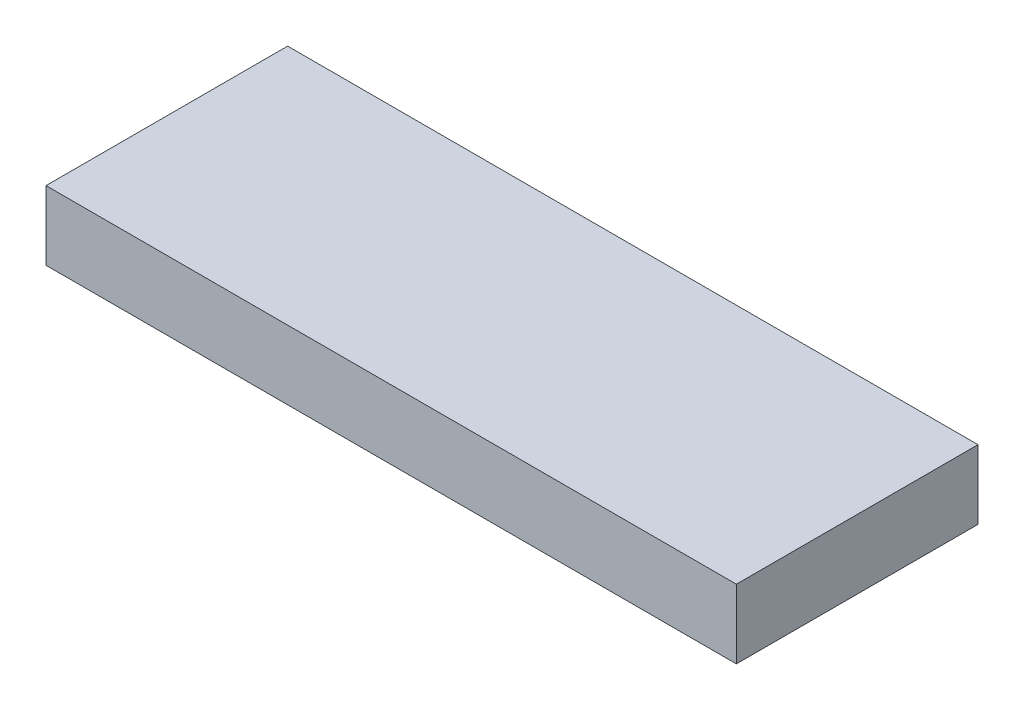
ISO-10303-21;
HEADER;
FILE_DESCRIPTION(('STEP AP214'),'2;1');
FILE_NAME('part.step','',(''),(''),'','','');
FILE_SCHEMA(('AUTOMOTIVE_DESIGN { 1 0 10303 214 1 1 1 1 }'));
ENDSEC;
DATA;
#1=APPLICATION_CONTEXT('core data for automotive mechanical design processes');
#2=APPLICATION_PROTOCOL_DEFINITION('international standard','automotive_design',2000,#1);
#3=PRODUCT_CONTEXT('',#1,'mechanical');
#4=PRODUCT('Part','Part','',(#3));
#5=PRODUCT_RELATED_PRODUCT_CATEGORY('part','',(#4));
#6=PRODUCT_DEFINITION_FORMATION('','',#4);
#7=PRODUCT_DEFINITION_CONTEXT('part definition',#1,'design');
#8=PRODUCT_DEFINITION('design','',#6,#7);
#9=PRODUCT_DEFINITION_SHAPE('','',#8);
#10=(LENGTH_UNIT() NAMED_UNIT(*) SI_UNIT(.MILLI.,.METRE.));
#11=(NAMED_UNIT(*) PLANE_ANGLE_UNIT() SI_UNIT($,.RADIAN.));
#12=(NAMED_UNIT(*) SI_UNIT($,.STERADIAN.) SOLID_ANGLE_UNIT());
#13=UNCERTAINTY_MEASURE_WITH_UNIT(LENGTH_MEASURE(1.E-05),#10,'distance_accuracy_value','');
#14=(GEOMETRIC_REPRESENTATION_CONTEXT(3) GLOBAL_UNCERTAINTY_ASSIGNED_CONTEXT((#13)) GLOBAL_UNIT_ASSIGNED_CONTEXT((#10,
#11,#12)) REPRESENTATION_CONTEXT('',''));
#15=CARTESIAN_POINT('',(0.,0.,0.));
#16=DIRECTION('',(0.,0.,1.));
#17=DIRECTION('',(1.,0.,0.));
#18=AXIS2_PLACEMENT_3D('',#15,#16,#17);
#19=CARTESIAN_POINT('',(500.,100.,175.));
#20=DIRECTION('',(-1.,0.,0.));
#21=DIRECTION('',(0.,0.,1.));
#22=AXIS2_PLACEMENT_3D('',#19,#20,#21);
#23=PLANE('',#22);
#24=DIRECTION('',(0.,0.,-1.));
#25=VECTOR('',#24,1.);
#26=CARTESIAN_POINT('',(500.,0.,175.));
#27=LINE('',#26,#25);
#28=CARTESIAN_POINT('',(500.,0.,175.));
#29=VERTEX_POINT('',#28);
#30=CARTESIAN_POINT('',(500.,0.,-175.));
#31=VERTEX_POINT('',#30);
#32=EDGE_CURVE('E107',#29,#31,#27,.T.);
#33=ORIENTED_EDGE('',*,*,#32,.T.);
#34=DIRECTION('',(0.,-1.,0.));
#35=VECTOR('',#34,1.);
#36=CARTESIAN_POINT('',(500.,100.,-175.));
#37=LINE('',#36,#35);
#38=CARTESIAN_POINT('',(500.,100.,-175.));
#39=VERTEX_POINT('',#38);
#40=EDGE_CURVE('E11',#39,#31,#37,.T.);
#41=ORIENTED_EDGE('',*,*,#40,.F.);
#42=DIRECTION('',(0.,0.,-1.));
#43=VECTOR('',#42,1.);
#44=CARTESIAN_POINT('',(500.,100.,175.));
#45=LINE('',#44,#43);
#46=CARTESIAN_POINT('',(500.,100.,175.));
#47=VERTEX_POINT('',#46);
#48=EDGE_CURVE('E96',#47,#39,#45,.T.);
#49=ORIENTED_EDGE('',*,*,#48,.F.);
#50=DIRECTION('',(0.,-1.,0.));
#51=VECTOR('',#50,1.);
#52=CARTESIAN_POINT('',(500.,100.,175.));
#53=LINE('',#52,#51);
#54=EDGE_CURVE('E102',#47,#29,#53,.T.);
#55=ORIENTED_EDGE('',*,*,#54,.T.);
#56=EDGE_LOOP('',(#33,#41,#49,#55));
#57=FACE_BOUND('',#56,.T.);
#58=ADVANCED_FACE('F44',(#57),#23,.F.);
#59=CARTESIAN_POINT('',(-500.,100.,-175.));
#60=DIRECTION('',(0.,0.,1.));
#61=DIRECTION('',(1.,0.,0.));
#62=AXIS2_PLACEMENT_3D('',#59,#60,#61);
#63=PLANE('',#62);
#64=DIRECTION('',(-1.,0.,0.));
#65=VECTOR('',#64,1.);
#66=CARTESIAN_POINT('',(-500.,0.,-175.));
#67=LINE('',#66,#65);
#68=CARTESIAN_POINT('',(-500.,0.,-175.));
#69=VERTEX_POINT('',#68);
#70=EDGE_CURVE('E99',#31,#69,#67,.T.);
#71=ORIENTED_EDGE('',*,*,#70,.T.);
#72=DIRECTION('',(0.,-1.,0.));
#73=VECTOR('',#72,1.);
#74=CARTESIAN_POINT('',(-500.,100.,-175.));
#75=LINE('',#74,#73);
#76=CARTESIAN_POINT('',(-500.,100.,-175.));
#77=VERTEX_POINT('',#76);
#78=EDGE_CURVE('E52',#77,#69,#75,.T.);
#79=ORIENTED_EDGE('',*,*,#78,.F.);
#80=DIRECTION('',(-1.,0.,0.));
#81=VECTOR('',#80,1.);
#82=CARTESIAN_POINT('',(-500.,100.,-175.));
#83=LINE('',#82,#81);
#84=EDGE_CURVE('E93',#39,#77,#83,.T.);
#85=ORIENTED_EDGE('',*,*,#84,.F.);
#86=ORIENTED_EDGE('',*,*,#40,.T.);
#87=EDGE_LOOP('',(#71,#79,#85,#86));
#88=FACE_BOUND('',#87,.T.);
#89=ADVANCED_FACE('F97',(#88),#63,.F.);
#90=CARTESIAN_POINT('',(-500.,100.,175.));
#91=DIRECTION('',(1.,0.,0.));
#92=DIRECTION('',(0.,0.,-1.));
#93=AXIS2_PLACEMENT_3D('',#90,#91,#92);
#94=PLANE('',#93);
#95=DIRECTION('',(0.,0.,1.));
#96=VECTOR('',#95,1.);
#97=CARTESIAN_POINT('',(-500.,0.,175.));
#98=LINE('',#97,#96);
#99=CARTESIAN_POINT('',(-500.,0.,175.));
#100=VERTEX_POINT('',#99);
#101=EDGE_CURVE('E79',#69,#100,#98,.T.);
#102=ORIENTED_EDGE('',*,*,#101,.T.);
#103=DIRECTION('',(0.,-1.,0.));
#104=VECTOR('',#103,1.);
#105=CARTESIAN_POINT('',(-500.,100.,175.));
#106=LINE('',#105,#104);
#107=CARTESIAN_POINT('',(-500.,100.,175.));
#108=VERTEX_POINT('',#107);
#109=EDGE_CURVE('E101',#108,#100,#106,.T.);
#110=ORIENTED_EDGE('',*,*,#109,.F.);
#111=DIRECTION('',(0.,0.,1.));
#112=VECTOR('',#111,1.);
#113=CARTESIAN_POINT('',(-500.,100.,175.));
#114=LINE('',#113,#112);
#115=EDGE_CURVE('E94',#77,#108,#114,.T.);
#116=ORIENTED_EDGE('',*,*,#115,.F.);
#117=ORIENTED_EDGE('',*,*,#78,.T.);
#118=EDGE_LOOP('',(#102,#110,#116,#117));
#119=FACE_BOUND('',#118,.T.);
#120=ADVANCED_FACE('F105',(#119),#94,.F.);
#121=CARTESIAN_POINT('',(-500.,100.,175.));
#122=DIRECTION('',(0.,0.,-1.));
#123=DIRECTION('',(-1.,0.,0.));
#124=AXIS2_PLACEMENT_3D('',#121,#122,#123);
#125=PLANE('',#124);
#126=DIRECTION('',(1.,0.,0.));
#127=VECTOR('',#126,1.);
#128=CARTESIAN_POINT('',(-500.,0.,175.));
#129=LINE('',#128,#127);
#130=EDGE_CURVE('E83',#100,#29,#129,.T.);
#131=ORIENTED_EDGE('',*,*,#130,.T.);
#132=ORIENTED_EDGE('',*,*,#54,.F.);
#133=DIRECTION('',(1.,0.,0.));
#134=VECTOR('',#133,1.);
#135=CARTESIAN_POINT('',(-500.,100.,175.));
#136=LINE('',#135,#134);
#137=EDGE_CURVE('E62',#108,#47,#136,.T.);
#138=ORIENTED_EDGE('',*,*,#137,.F.);
#139=ORIENTED_EDGE('',*,*,#109,.T.);
#140=EDGE_LOOP('',(#131,#132,#138,#139));
#141=FACE_BOUND('',#140,.T.);
#142=ADVANCED_FACE('F113',(#141),#125,.F.);
#143=CARTESIAN_POINT('',(0.,100.,0.));
#144=DIRECTION('',(0.,-1.,0.));
#145=DIRECTION('',(0.,0.,-1.));
#146=AXIS2_PLACEMENT_3D('',#143,#144,#145);
#147=PLANE('',#146);
#148=ORIENTED_EDGE('',*,*,#48,.T.);
#149=ORIENTED_EDGE('',*,*,#84,.T.);
#150=ORIENTED_EDGE('',*,*,#115,.T.);
#151=ORIENTED_EDGE('',*,*,#137,.T.);
#152=EDGE_LOOP('',(#148,#149,#150,#151));
#153=FACE_BOUND('',#152,.T.);
#154=ADVANCED_FACE('F95',(#153),#147,.F.);
#155=CARTESIAN_POINT('',(0.,0.,0.));
#156=DIRECTION('',(0.,-1.,0.));
#157=DIRECTION('',(0.,0.,-1.));
#158=AXIS2_PLACEMENT_3D('',#155,#156,#157);
#159=PLANE('',#158);
#160=ORIENTED_EDGE('',*,*,#32,.F.);
#161=ORIENTED_EDGE('',*,*,#130,.F.);
#162=ORIENTED_EDGE('',*,*,#101,.F.);
#163=ORIENTED_EDGE('',*,*,#70,.F.);
#164=EDGE_LOOP('',(#160,#161,#162,#163));
#165=FACE_BOUND('',#164,.T.);
#166=ADVANCED_FACE('F119',(#165),#159,.T.);
#167=CLOSED_SHELL('',(#58,#89,#120,#142,#154,#166));
#168=MANIFOLD_SOLID_BREP('B2',#167);
#169=ADVANCED_BREP_SHAPE_REPRESENTATION('',(#18,#168),#14);
#170=SHAPE_DEFINITION_REPRESENTATION(#9,#169);
ENDSEC;
END-ISO-10303-21;
